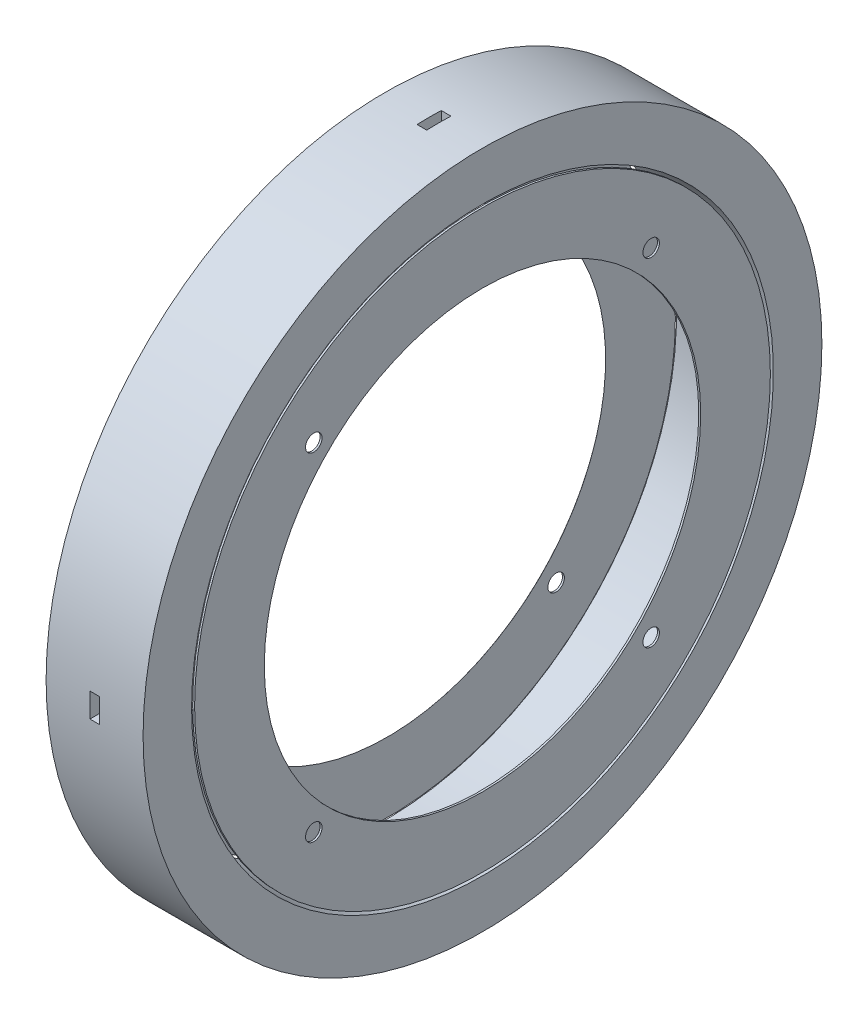
ISO-10303-21;
HEADER;
FILE_DESCRIPTION(('STEP AP214'),'2;1');
FILE_NAME('part.step','',(''),(''),'','','');
FILE_SCHEMA(('AUTOMOTIVE_DESIGN { 1 0 10303 214 1 1 1 1 }'));
ENDSEC;
DATA;
#1=APPLICATION_CONTEXT('core data for automotive mechanical design processes');
#2=APPLICATION_PROTOCOL_DEFINITION('international standard','automotive_design',2000,#1);
#3=PRODUCT_CONTEXT('',#1,'mechanical');
#4=PRODUCT('Part','Part','',(#3));
#5=PRODUCT_RELATED_PRODUCT_CATEGORY('part','',(#4));
#6=PRODUCT_DEFINITION_FORMATION('','',#4);
#7=PRODUCT_DEFINITION_CONTEXT('part definition',#1,'design');
#8=PRODUCT_DEFINITION('design','',#6,#7);
#9=PRODUCT_DEFINITION_SHAPE('','',#8);
#10=(LENGTH_UNIT() NAMED_UNIT(*) SI_UNIT(.MILLI.,.METRE.));
#11=(NAMED_UNIT(*) PLANE_ANGLE_UNIT() SI_UNIT($,.RADIAN.));
#12=(NAMED_UNIT(*) SI_UNIT($,.STERADIAN.) SOLID_ANGLE_UNIT());
#13=UNCERTAINTY_MEASURE_WITH_UNIT(LENGTH_MEASURE(1.E-05),#10,'distance_accuracy_value','');
#14=(GEOMETRIC_REPRESENTATION_CONTEXT(3) GLOBAL_UNCERTAINTY_ASSIGNED_CONTEXT((#13)) GLOBAL_UNIT_ASSIGNED_CONTEXT((#10,
#11,#12)) REPRESENTATION_CONTEXT('',''));
#15=CARTESIAN_POINT('',(0.,0.,0.));
#16=DIRECTION('',(0.,0.,1.));
#17=DIRECTION('',(1.,0.,0.));
#18=AXIS2_PLACEMENT_3D('',#15,#16,#17);
#19=CARTESIAN_POINT('',(10.,0.,0.));
#20=DIRECTION('',(-1.,0.,0.));
#21=DIRECTION('',(0.,0.,1.));
#22=AXIS2_PLACEMENT_3D('',#19,#20,#21);
#23=CYLINDRICAL_SURFACE('',#22,29.6875);
#24=CARTESIAN_POINT('',(10.,0.,0.));
#25=DIRECTION('',(-1.,0.,0.));
#26=DIRECTION('',(0.,0.,-1.));
#27=AXIS2_PLACEMENT_3D('',#24,#25,#26);
#28=CIRCLE('',#27,29.6875);
#29=CARTESIAN_POINT('',(10.,0.,-29.6875));
#30=VERTEX_POINT('',#29);
#31=EDGE_CURVE('E11',#30,#30,#28,.T.);
#32=ORIENTED_EDGE('',*,*,#31,.T.);
#33=EDGE_LOOP('',(#32));
#34=FACE_BOUND('',#33,.T.);
#35=CARTESIAN_POINT('',(9.8,0.,0.));
#36=DIRECTION('',(-1.,0.,0.));
#37=DIRECTION('',(0.,0.,-1.));
#38=AXIS2_PLACEMENT_3D('',#35,#36,#37);
#39=CIRCLE('',#38,29.6875);
#40=CARTESIAN_POINT('',(9.8,0.,-29.6875));
#41=VERTEX_POINT('',#40);
#42=EDGE_CURVE('E46',#41,#41,#39,.T.);
#43=ORIENTED_EDGE('',*,*,#42,.F.);
#44=EDGE_LOOP('',(#43));
#45=FACE_BOUND('',#44,.T.);
#46=ADVANCED_FACE('F39',(#34,#45),#23,.T.);
#47=CARTESIAN_POINT('',(10.,0.,0.));
#48=DIRECTION('',(1.,0.,0.));
#49=DIRECTION('',(0.,0.,-1.));
#50=AXIS2_PLACEMENT_3D('',#47,#48,#49);
#51=PLANE('',#50);
#52=CARTESIAN_POINT('',(10.,17.3948268171891,17.3948268171891));
#53=DIRECTION('',(1.,0.,0.));
#54=DIRECTION('',(0.,0.,-1.));
#55=AXIS2_PLACEMENT_3D('',#52,#53,#54);
#56=CIRCLE('',#55,0.849999999999993);
#57=CARTESIAN_POINT('',(10.,17.3948268171891,16.5448268171891));
#58=VERTEX_POINT('',#57);
#59=EDGE_CURVE('E82',#58,#58,#56,.T.);
#60=ORIENTED_EDGE('',*,*,#59,.F.);
#61=EDGE_LOOP('',(#60));
#62=FACE_BOUND('',#61,.T.);
#63=CARTESIAN_POINT('',(10.,-17.3948268171891,17.3948268171891));
#64=DIRECTION('',(1.,0.,0.));
#65=DIRECTION('',(0.,0.,-1.));
#66=AXIS2_PLACEMENT_3D('',#63,#64,#65);
#67=CIRCLE('',#66,0.849999999999993);
#68=CARTESIAN_POINT('',(10.,-17.3948268171891,16.5448268171891));
#69=VERTEX_POINT('',#68);
#70=EDGE_CURVE('E76',#69,#69,#67,.T.);
#71=ORIENTED_EDGE('',*,*,#70,.F.);
#72=EDGE_LOOP('',(#71));
#73=FACE_BOUND('',#72,.T.);
#74=CARTESIAN_POINT('',(10.,-17.3948268171891,-17.3948268171891));
#75=DIRECTION('',(1.,0.,0.));
#76=DIRECTION('',(0.,0.,-1.));
#77=AXIS2_PLACEMENT_3D('',#74,#75,#76);
#78=CIRCLE('',#77,0.849999999999993);
#79=CARTESIAN_POINT('',(10.,-17.3948268171891,-18.2448268171891));
#80=VERTEX_POINT('',#79);
#81=EDGE_CURVE('E73',#80,#80,#78,.T.);
#82=ORIENTED_EDGE('',*,*,#81,.F.);
#83=EDGE_LOOP('',(#82));
#84=FACE_BOUND('',#83,.T.);
#85=CARTESIAN_POINT('',(10.,17.3948268171891,-17.3948268171891));
#86=DIRECTION('',(1.,0.,0.));
#87=DIRECTION('',(0.,0.,-1.));
#88=AXIS2_PLACEMENT_3D('',#85,#86,#87);
#89=CIRCLE('',#88,0.849999999999993);
#90=CARTESIAN_POINT('',(10.,17.3948268171891,-18.2448268171891));
#91=VERTEX_POINT('',#90);
#92=EDGE_CURVE('E64',#91,#91,#89,.T.);
#93=ORIENTED_EDGE('',*,*,#92,.F.);
#94=EDGE_LOOP('',(#93));
#95=FACE_BOUND('',#94,.T.);
#96=CARTESIAN_POINT('',(10.,0.,0.));
#97=DIRECTION('',(1.,0.,0.));
#98=DIRECTION('',(0.,0.,1.));
#99=AXIS2_PLACEMENT_3D('',#96,#97,#98);
#100=CIRCLE('',#99,22.5);
#101=CARTESIAN_POINT('',(10.,0.,22.5));
#102=VERTEX_POINT('',#101);
#103=EDGE_CURVE('E54',#102,#102,#100,.T.);
#104=ORIENTED_EDGE('',*,*,#103,.F.);
#105=EDGE_LOOP('',(#104));
#106=FACE_BOUND('',#105,.T.);
#107=ORIENTED_EDGE('',*,*,#31,.F.);
#108=EDGE_LOOP('',(#107));
#109=FACE_BOUND('',#108,.T.);
#110=ADVANCED_FACE('F89',(#62,#73,#84,#95,#106,#109),#51,.T.);
#111=CARTESIAN_POINT('',(9.8,0.,0.));
#112=DIRECTION('',(1.,0.,0.));
#113=DIRECTION('',(0.,0.,-1.));
#114=AXIS2_PLACEMENT_3D('',#111,#112,#113);
#115=PLANE('',#114);
#116=CARTESIAN_POINT('',(9.8,17.3948268171891,17.3948268171891));
#117=DIRECTION('',(1.,0.,0.));
#118=DIRECTION('',(0.,0.,-1.));
#119=AXIS2_PLACEMENT_3D('',#116,#117,#118);
#120=CIRCLE('',#119,0.849999999999993);
#121=CARTESIAN_POINT('',(9.8,17.3948268171891,16.5448268171891));
#122=VERTEX_POINT('',#121);
#123=EDGE_CURVE('E79',#122,#122,#120,.T.);
#124=ORIENTED_EDGE('',*,*,#123,.T.);
#125=EDGE_LOOP('',(#124));
#126=FACE_BOUND('',#125,.T.);
#127=CARTESIAN_POINT('',(9.8,-17.3948268171891,17.3948268171891));
#128=DIRECTION('',(1.,0.,0.));
#129=DIRECTION('',(0.,0.,-1.));
#130=AXIS2_PLACEMENT_3D('',#127,#128,#129);
#131=CIRCLE('',#130,0.849999999999993);
#132=CARTESIAN_POINT('',(9.8,-17.3948268171891,16.5448268171891));
#133=VERTEX_POINT('',#132);
#134=EDGE_CURVE('E42',#133,#133,#131,.T.);
#135=ORIENTED_EDGE('',*,*,#134,.T.);
#136=EDGE_LOOP('',(#135));
#137=FACE_BOUND('',#136,.T.);
#138=CARTESIAN_POINT('',(9.8,-17.3948268171891,-17.3948268171891));
#139=DIRECTION('',(1.,0.,0.));
#140=DIRECTION('',(0.,0.,-1.));
#141=AXIS2_PLACEMENT_3D('',#138,#139,#140);
#142=CIRCLE('',#141,0.849999999999993);
#143=CARTESIAN_POINT('',(9.8,-17.3948268171891,-18.2448268171891));
#144=VERTEX_POINT('',#143);
#145=EDGE_CURVE('E68',#144,#144,#142,.T.);
#146=ORIENTED_EDGE('',*,*,#145,.T.);
#147=EDGE_LOOP('',(#146));
#148=FACE_BOUND('',#147,.T.);
#149=CARTESIAN_POINT('',(9.8,17.3948268171891,-17.3948268171891));
#150=DIRECTION('',(1.,0.,0.));
#151=DIRECTION('',(0.,0.,-1.));
#152=AXIS2_PLACEMENT_3D('',#149,#150,#151);
#153=CIRCLE('',#152,0.849999999999993);
#154=CARTESIAN_POINT('',(9.8,17.3948268171891,-18.2448268171891));
#155=VERTEX_POINT('',#154);
#156=EDGE_CURVE('E60',#155,#155,#153,.T.);
#157=ORIENTED_EDGE('',*,*,#156,.T.);
#158=EDGE_LOOP('',(#157));
#159=FACE_BOUND('',#158,.T.);
#160=CARTESIAN_POINT('',(9.8,0.,0.));
#161=DIRECTION('',(1.,0.,0.));
#162=DIRECTION('',(0.,0.,-1.));
#163=AXIS2_PLACEMENT_3D('',#160,#161,#162);
#164=CIRCLE('',#163,22.5);
#165=CARTESIAN_POINT('',(9.8,0.,-22.5));
#166=VERTEX_POINT('',#165);
#167=EDGE_CURVE('E51',#166,#166,#164,.T.);
#168=ORIENTED_EDGE('',*,*,#167,.T.);
#169=EDGE_LOOP('',(#168));
#170=FACE_BOUND('',#169,.T.);
#171=ORIENTED_EDGE('',*,*,#42,.T.);
#172=EDGE_LOOP('',(#171));
#173=FACE_BOUND('',#172,.T.);
#174=ADVANCED_FACE('F92',(#126,#137,#148,#159,#170,#173),#115,.F.);
#175=CARTESIAN_POINT('',(6.66666666666667,0.,0.));
#176=DIRECTION('',(1.,0.,0.));
#177=DIRECTION('',(0.,0.,-1.));
#178=AXIS2_PLACEMENT_3D('',#175,#176,#177);
#179=CYLINDRICAL_SURFACE('',#178,22.5);
#180=ORIENTED_EDGE('',*,*,#103,.T.);
#181=EDGE_LOOP('',(#180));
#182=FACE_BOUND('',#181,.T.);
#183=ORIENTED_EDGE('',*,*,#167,.F.);
#184=EDGE_LOOP('',(#183));
#185=FACE_BOUND('',#184,.T.);
#186=ADVANCED_FACE('F106',(#182,#185),#179,.F.);
#187=CARTESIAN_POINT('',(10.,17.3948268171891,-17.3948268171891));
#188=DIRECTION('',(1.,0.,0.));
#189=DIRECTION('',(0.,0.,-1.));
#190=AXIS2_PLACEMENT_3D('',#187,#188,#189);
#191=CYLINDRICAL_SURFACE('',#190,0.849999999999993);
#192=ORIENTED_EDGE('',*,*,#92,.T.);
#193=EDGE_LOOP('',(#192));
#194=FACE_BOUND('',#193,.T.);
#195=ORIENTED_EDGE('',*,*,#156,.F.);
#196=EDGE_LOOP('',(#195));
#197=FACE_BOUND('',#196,.T.);
#198=ADVANCED_FACE('F102',(#194,#197),#191,.F.);
#199=CARTESIAN_POINT('',(10.,-17.3948268171891,-17.3948268171891));
#200=DIRECTION('',(1.,0.,0.));
#201=DIRECTION('',(0.,0.,-1.));
#202=AXIS2_PLACEMENT_3D('',#199,#200,#201);
#203=CYLINDRICAL_SURFACE('',#202,0.849999999999993);
#204=ORIENTED_EDGE('',*,*,#81,.T.);
#205=EDGE_LOOP('',(#204));
#206=FACE_BOUND('',#205,.T.);
#207=ORIENTED_EDGE('',*,*,#145,.F.);
#208=EDGE_LOOP('',(#207));
#209=FACE_BOUND('',#208,.T.);
#210=ADVANCED_FACE('F105',(#206,#209),#203,.F.);
#211=CARTESIAN_POINT('',(10.,-17.3948268171891,17.3948268171891));
#212=DIRECTION('',(1.,0.,0.));
#213=DIRECTION('',(0.,0.,-1.));
#214=AXIS2_PLACEMENT_3D('',#211,#212,#213);
#215=CYLINDRICAL_SURFACE('',#214,0.849999999999993);
#216=ORIENTED_EDGE('',*,*,#70,.T.);
#217=EDGE_LOOP('',(#216));
#218=FACE_BOUND('',#217,.T.);
#219=ORIENTED_EDGE('',*,*,#134,.F.);
#220=EDGE_LOOP('',(#219));
#221=FACE_BOUND('',#220,.T.);
#222=ADVANCED_FACE('F112',(#218,#221),#215,.F.);
#223=CARTESIAN_POINT('',(10.,17.3948268171891,17.3948268171891));
#224=DIRECTION('',(1.,0.,0.));
#225=DIRECTION('',(0.,0.,-1.));
#226=AXIS2_PLACEMENT_3D('',#223,#224,#225);
#227=CYLINDRICAL_SURFACE('',#226,0.849999999999993);
#228=ORIENTED_EDGE('',*,*,#59,.T.);
#229=EDGE_LOOP('',(#228));
#230=FACE_BOUND('',#229,.T.);
#231=ORIENTED_EDGE('',*,*,#123,.F.);
#232=EDGE_LOOP('',(#231));
#233=FACE_BOUND('',#232,.T.);
#234=ADVANCED_FACE('F86',(#230,#233),#227,.F.);
#235=CLOSED_SHELL('',(#46,#110,#174,#186,#198,#210,#222,#234));
#236=MANIFOLD_SOLID_BREP('B2',#235);
#237=CARTESIAN_POINT('',(0.,0.,0.));
#238=DIRECTION('',(1.,0.,0.));
#239=DIRECTION('',(0.,0.,-1.));
#240=AXIS2_PLACEMENT_3D('',#237,#238,#239);
#241=CYLINDRICAL_SURFACE('',#240,29.6875);
#242=CARTESIAN_POINT('',(0.,0.,0.));
#243=DIRECTION('',(1.,0.,0.));
#244=DIRECTION('',(0.,0.,1.));
#245=AXIS2_PLACEMENT_3D('',#242,#243,#244);
#246=CIRCLE('',#245,29.6875);
#247=CARTESIAN_POINT('',(0.,0.,29.6875));
#248=VERTEX_POINT('',#247);
#249=EDGE_CURVE('E200',#248,#248,#246,.T.);
#250=ORIENTED_EDGE('',*,*,#249,.T.);
#251=EDGE_LOOP('',(#250));
#252=FACE_BOUND('',#251,.T.);
#253=CARTESIAN_POINT('',(0.2,0.,0.));
#254=DIRECTION('',(1.,0.,0.));
#255=DIRECTION('',(0.,0.,1.));
#256=AXIS2_PLACEMENT_3D('',#253,#254,#255);
#257=CIRCLE('',#256,29.6875);
#258=CARTESIAN_POINT('',(0.2,0.,29.6875));
#259=VERTEX_POINT('',#258);
#260=EDGE_CURVE('E204',#259,#259,#257,.T.);
#261=ORIENTED_EDGE('',*,*,#260,.F.);
#262=EDGE_LOOP('',(#261));
#263=FACE_BOUND('',#262,.T.);
#264=ADVANCED_FACE('F193',(#252,#263),#241,.T.);
#265=CARTESIAN_POINT('',(0.,0.,0.));
#266=DIRECTION('',(-1.,0.,0.));
#267=DIRECTION('',(0.,0.,1.));
#268=AXIS2_PLACEMENT_3D('',#265,#266,#267);
#269=PLANE('',#268);
#270=CARTESIAN_POINT('',(0.,0.,0.));
#271=DIRECTION('',(-1.,0.,0.));
#272=DIRECTION('',(0.,0.,1.));
#273=AXIS2_PLACEMENT_3D('',#270,#271,#272);
#274=CIRCLE('',#273,22.9472135955);
#275=CARTESIAN_POINT('',(0.,0.,22.9472135955));
#276=VERTEX_POINT('',#275);
#277=EDGE_CURVE('E38',#276,#276,#274,.F.);
#278=ORIENTED_EDGE('',*,*,#277,.T.);
#279=EDGE_LOOP('',(#278));
#280=FACE_BOUND('',#279,.T.);
#281=CARTESIAN_POINT('',(0.,17.3948268171891,17.3948268171891));
#282=DIRECTION('',(-1.,0.,0.));
#283=DIRECTION('',(0.,0.,1.));
#284=AXIS2_PLACEMENT_3D('',#281,#282,#283);
#285=CIRCLE('',#284,0.849999999999993);
#286=CARTESIAN_POINT('',(0.,17.3948268171891,18.2448268171891));
#287=VERTEX_POINT('',#286);
#288=EDGE_CURVE('E223',#287,#287,#285,.T.);
#289=ORIENTED_EDGE('',*,*,#288,.F.);
#290=EDGE_LOOP('',(#289));
#291=FACE_BOUND('',#290,.T.);
#292=CARTESIAN_POINT('',(0.,-17.3948268171891,17.3948268171891));
#293=DIRECTION('',(-1.,0.,0.));
#294=DIRECTION('',(0.,0.,1.));
#295=AXIS2_PLACEMENT_3D('',#292,#293,#294);
#296=CIRCLE('',#295,0.849999999999993);
#297=CARTESIAN_POINT('',(0.,-17.3948268171891,18.2448268171891));
#298=VERTEX_POINT('',#297);
#299=EDGE_CURVE('E220',#298,#298,#296,.T.);
#300=ORIENTED_EDGE('',*,*,#299,.F.);
#301=EDGE_LOOP('',(#300));
#302=FACE_BOUND('',#301,.T.);
#303=CARTESIAN_POINT('',(0.,-17.3948268171891,-17.3948268171891));
#304=DIRECTION('',(-1.,0.,0.));
#305=DIRECTION('',(0.,0.,1.));
#306=AXIS2_PLACEMENT_3D('',#303,#304,#305);
#307=CIRCLE('',#306,0.849999999999993);
#308=CARTESIAN_POINT('',(0.,-17.3948268171891,-16.5448268171891));
#309=VERTEX_POINT('',#308);
#310=EDGE_CURVE('E219',#309,#309,#307,.T.);
#311=ORIENTED_EDGE('',*,*,#310,.F.);
#312=EDGE_LOOP('',(#311));
#313=FACE_BOUND('',#312,.T.);
#314=CARTESIAN_POINT('',(0.,17.3948268171891,-17.3948268171891));
#315=DIRECTION('',(-1.,0.,0.));
#316=DIRECTION('',(0.,0.,1.));
#317=AXIS2_PLACEMENT_3D('',#314,#315,#316);
#318=CIRCLE('',#317,0.849999999999993);
#319=CARTESIAN_POINT('',(0.,17.3948268171891,-16.5448268171891));
#320=VERTEX_POINT('',#319);
#321=EDGE_CURVE('E237',#320,#320,#318,.T.);
#322=ORIENTED_EDGE('',*,*,#321,.F.);
#323=EDGE_LOOP('',(#322));
#324=FACE_BOUND('',#323,.T.);
#325=ORIENTED_EDGE('',*,*,#249,.F.);
#326=EDGE_LOOP('',(#325));
#327=FACE_BOUND('',#326,.T.);
#328=ADVANCED_FACE('F258',(#280,#291,#302,#313,#324,#327),#269,.T.);
#329=CARTESIAN_POINT('',(0.2,0.,0.));
#330=DIRECTION('',(-1.,0.,0.));
#331=DIRECTION('',(0.,0.,1.));
#332=AXIS2_PLACEMENT_3D('',#329,#330,#331);
#333=PLANE('',#332);
#334=CARTESIAN_POINT('',(0.2,17.3948268171891,17.3948268171891));
#335=DIRECTION('',(-1.,0.,0.));
#336=DIRECTION('',(0.,0.,1.));
#337=AXIS2_PLACEMENT_3D('',#334,#335,#336);
#338=CIRCLE('',#337,0.849999999999993);
#339=CARTESIAN_POINT('',(0.2,17.3948268171891,18.2448268171891));
#340=VERTEX_POINT('',#339);
#341=EDGE_CURVE('E221',#340,#340,#338,.T.);
#342=ORIENTED_EDGE('',*,*,#341,.T.);
#343=EDGE_LOOP('',(#342));
#344=FACE_BOUND('',#343,.T.);
#345=CARTESIAN_POINT('',(0.2,-17.3948268171891,17.3948268171891));
#346=DIRECTION('',(-1.,0.,0.));
#347=DIRECTION('',(0.,0.,1.));
#348=AXIS2_PLACEMENT_3D('',#345,#346,#347);
#349=CIRCLE('',#348,0.849999999999993);
#350=CARTESIAN_POINT('',(0.2,-17.3948268171891,18.2448268171891));
#351=VERTEX_POINT('',#350);
#352=EDGE_CURVE('E217',#351,#351,#349,.T.);
#353=ORIENTED_EDGE('',*,*,#352,.T.);
#354=EDGE_LOOP('',(#353));
#355=FACE_BOUND('',#354,.T.);
#356=CARTESIAN_POINT('',(0.2,-17.3948268171891,-17.3948268171891));
#357=DIRECTION('',(-1.,0.,0.));
#358=DIRECTION('',(0.,0.,1.));
#359=AXIS2_PLACEMENT_3D('',#356,#357,#358);
#360=CIRCLE('',#359,0.849999999999993);
#361=CARTESIAN_POINT('',(0.2,-17.3948268171891,-16.5448268171891));
#362=VERTEX_POINT('',#361);
#363=EDGE_CURVE('E235',#362,#362,#360,.T.);
#364=ORIENTED_EDGE('',*,*,#363,.T.);
#365=EDGE_LOOP('',(#364));
#366=FACE_BOUND('',#365,.T.);
#367=CARTESIAN_POINT('',(0.2,17.3948268171891,-17.3948268171891));
#368=DIRECTION('',(-1.,0.,0.));
#369=DIRECTION('',(0.,0.,1.));
#370=AXIS2_PLACEMENT_3D('',#367,#368,#369);
#371=CIRCLE('',#370,0.849999999999993);
#372=CARTESIAN_POINT('',(0.2,17.3948268171891,-16.5448268171891));
#373=VERTEX_POINT('',#372);
#374=EDGE_CURVE('E212',#373,#373,#371,.T.);
#375=ORIENTED_EDGE('',*,*,#374,.T.);
#376=EDGE_LOOP('',(#375));
#377=FACE_BOUND('',#376,.T.);
#378=CARTESIAN_POINT('',(0.2,0.,0.));
#379=DIRECTION('',(-1.,0.,0.));
#380=DIRECTION('',(0.,0.,1.));
#381=AXIS2_PLACEMENT_3D('',#378,#379,#380);
#382=CIRCLE('',#381,22.5);
#383=CARTESIAN_POINT('',(0.2,0.,22.5));
#384=VERTEX_POINT('',#383);
#385=EDGE_CURVE('E209',#384,#384,#382,.T.);
#386=ORIENTED_EDGE('',*,*,#385,.T.);
#387=EDGE_LOOP('',(#386));
#388=FACE_BOUND('',#387,.T.);
#389=ORIENTED_EDGE('',*,*,#260,.T.);
#390=EDGE_LOOP('',(#389));
#391=FACE_BOUND('',#390,.T.);
#392=ADVANCED_FACE('F244',(#344,#355,#366,#377,#388,#391),#333,.F.);
#393=CARTESIAN_POINT('',(0.,17.3948268171891,-17.3948268171891));
#394=DIRECTION('',(-1.,0.,0.));
#395=DIRECTION('',(0.,0.,1.));
#396=AXIS2_PLACEMENT_3D('',#393,#394,#395);
#397=CYLINDRICAL_SURFACE('',#396,0.849999999999993);
#398=ORIENTED_EDGE('',*,*,#321,.T.);
#399=EDGE_LOOP('',(#398));
#400=FACE_BOUND('',#399,.T.);
#401=ORIENTED_EDGE('',*,*,#374,.F.);
#402=EDGE_LOOP('',(#401));
#403=FACE_BOUND('',#402,.T.);
#404=ADVANCED_FACE('F247',(#400,#403),#397,.F.);
#405=CARTESIAN_POINT('',(0.,-17.3948268171891,-17.3948268171891));
#406=DIRECTION('',(-1.,0.,0.));
#407=DIRECTION('',(0.,0.,1.));
#408=AXIS2_PLACEMENT_3D('',#405,#406,#407);
#409=CYLINDRICAL_SURFACE('',#408,0.849999999999993);
#410=ORIENTED_EDGE('',*,*,#310,.T.);
#411=EDGE_LOOP('',(#410));
#412=FACE_BOUND('',#411,.T.);
#413=ORIENTED_EDGE('',*,*,#363,.F.);
#414=EDGE_LOOP('',(#413));
#415=FACE_BOUND('',#414,.T.);
#416=ADVANCED_FACE('F249',(#412,#415),#409,.F.);
#417=CARTESIAN_POINT('',(0.,-17.3948268171891,17.3948268171891));
#418=DIRECTION('',(-1.,0.,0.));
#419=DIRECTION('',(0.,0.,1.));
#420=AXIS2_PLACEMENT_3D('',#417,#418,#419);
#421=CYLINDRICAL_SURFACE('',#420,0.849999999999993);
#422=ORIENTED_EDGE('',*,*,#299,.T.);
#423=EDGE_LOOP('',(#422));
#424=FACE_BOUND('',#423,.T.);
#425=ORIENTED_EDGE('',*,*,#352,.F.);
#426=EDGE_LOOP('',(#425));
#427=FACE_BOUND('',#426,.T.);
#428=ADVANCED_FACE('F255',(#424,#427),#421,.F.);
#429=CARTESIAN_POINT('',(0.,17.3948268171891,17.3948268171891));
#430=DIRECTION('',(-1.,0.,0.));
#431=DIRECTION('',(0.,0.,1.));
#432=AXIS2_PLACEMENT_3D('',#429,#430,#431);
#433=CYLINDRICAL_SURFACE('',#432,0.849999999999993);
#434=ORIENTED_EDGE('',*,*,#288,.T.);
#435=EDGE_LOOP('',(#434));
#436=FACE_BOUND('',#435,.T.);
#437=ORIENTED_EDGE('',*,*,#341,.F.);
#438=EDGE_LOOP('',(#437));
#439=FACE_BOUND('',#438,.T.);
#440=ADVANCED_FACE('F283',(#436,#439),#433,.F.);
#441=CARTESIAN_POINT('',(0.600000000000004,0.,0.));
#442=DIRECTION('',(-1.,0.,0.));
#443=DIRECTION('',(0.,0.,1.));
#444=AXIS2_PLACEMENT_3D('',#441,#442,#443);
#445=TOROIDAL_SURFACE('',#444,22.9472135955,0.600000000000004);
#446=ORIENTED_EDGE('',*,*,#277,.F.);
#447=EDGE_LOOP('',(#446));
#448=FACE_BOUND('',#447,.T.);
#449=ORIENTED_EDGE('',*,*,#385,.F.);
#450=EDGE_LOOP('',(#449));
#451=FACE_BOUND('',#450,.T.);
#452=ADVANCED_FACE('F195',(#448,#451),#445,.T.);
#453=CLOSED_SHELL('',(#264,#328,#392,#404,#416,#428,#440,#452));
#454=MANIFOLD_SOLID_BREP('B6',#453);
#455=CARTESIAN_POINT('',(0.,0.,0.));
#456=DIRECTION('',(1.,0.,0.));
#457=DIRECTION('',(0.,0.,-1.));
#458=AXIS2_PLACEMENT_3D('',#455,#456,#457);
#459=CYLINDRICAL_SURFACE('',#458,35.);
#460=CARTESIAN_POINT('',(5.5,0.,0.));
#461=DIRECTION('',(1.,0.,0.));
#462=DIRECTION('',(0.,0.,-1.));
#463=AXIS2_PLACEMENT_3D('',#460,#461,#462);
#464=CIRCLE('',#463,35.);
#465=CARTESIAN_POINT('',(5.5,-34.9776714490831,1.25));
#466=VERTEX_POINT('',#465);
#467=CARTESIAN_POINT('',(5.5,-34.9776714490831,-1.25));
#468=VERTEX_POINT('',#467);
#469=EDGE_CURVE('E480',#466,#468,#464,.T.);
#470=ORIENTED_EDGE('',*,*,#469,.T.);
#471=DIRECTION('',(1.,0.,0.));
#472=VECTOR('',#471,1.);
#473=CARTESIAN_POINT('',(0.,-34.9776714490831,-1.25));
#474=LINE('',#473,#472);
#475=CARTESIAN_POINT('',(4.5,-34.9776714490831,-1.25));
#476=VERTEX_POINT('',#475);
#477=EDGE_CURVE('E465',#468,#476,#474,.F.);
#478=ORIENTED_EDGE('',*,*,#477,.T.);
#479=CARTESIAN_POINT('',(4.5,0.,0.));
#480=DIRECTION('',(-1.,0.,0.));
#481=DIRECTION('',(0.,0.,1.));
#482=AXIS2_PLACEMENT_3D('',#479,#480,#481);
#483=CIRCLE('',#482,35.);
#484=CARTESIAN_POINT('',(4.5,-34.9776714490831,1.25));
#485=VERTEX_POINT('',#484);
#486=EDGE_CURVE('E456',#476,#485,#483,.T.);
#487=ORIENTED_EDGE('',*,*,#486,.T.);
#488=DIRECTION('',(1.,0.,0.));
#489=VECTOR('',#488,1.);
#490=CARTESIAN_POINT('',(0.,-34.9776714490831,1.25));
#491=LINE('',#490,#489);
#492=EDGE_CURVE('E477',#485,#466,#491,.T.);
#493=ORIENTED_EDGE('',*,*,#492,.T.);
#494=EDGE_LOOP('',(#470,#478,#487,#493));
#495=FACE_BOUND('',#494,.T.);
#496=CARTESIAN_POINT('',(4.5,0.,0.));
#497=DIRECTION('',(-1.,0.,0.));
#498=DIRECTION('',(0.,0.,1.));
#499=AXIS2_PLACEMENT_3D('',#496,#497,#498);
#500=CIRCLE('',#499,35.);
#501=CARTESIAN_POINT('',(4.5,34.9776714490831,1.25));
#502=VERTEX_POINT('',#501);
#503=CARTESIAN_POINT('',(4.5,34.9776714490831,-1.25));
#504=VERTEX_POINT('',#503);
#505=EDGE_CURVE('E501',#502,#504,#500,.T.);
#506=ORIENTED_EDGE('',*,*,#505,.T.);
#507=DIRECTION('',(1.,0.,0.));
#508=VECTOR('',#507,1.);
#509=CARTESIAN_POINT('',(0.,34.9776714490831,-1.25));
#510=LINE('',#509,#508);
#511=CARTESIAN_POINT('',(5.5,34.9776714490831,-1.25));
#512=VERTEX_POINT('',#511);
#513=EDGE_CURVE('E516',#504,#512,#510,.T.);
#514=ORIENTED_EDGE('',*,*,#513,.T.);
#515=CARTESIAN_POINT('',(5.5,0.,0.));
#516=DIRECTION('',(1.,0.,0.));
#517=DIRECTION('',(0.,0.,-1.));
#518=AXIS2_PLACEMENT_3D('',#515,#516,#517);
#519=CIRCLE('',#518,35.);
#520=CARTESIAN_POINT('',(5.5,34.9776714490831,1.25));
#521=VERTEX_POINT('',#520);
#522=EDGE_CURVE('E495',#512,#521,#519,.T.);
#523=ORIENTED_EDGE('',*,*,#522,.T.);
#524=DIRECTION('',(1.,0.,0.));
#525=VECTOR('',#524,1.);
#526=CARTESIAN_POINT('',(0.,34.9776714490831,1.25));
#527=LINE('',#526,#525);
#528=EDGE_CURVE('E498',#521,#502,#527,.F.);
#529=ORIENTED_EDGE('',*,*,#528,.T.);
#530=EDGE_LOOP('',(#506,#514,#523,#529));
#531=FACE_BOUND('',#530,.T.);
#532=CARTESIAN_POINT('',(4.5,0.,0.));
#533=DIRECTION('',(-1.,0.,0.));
#534=DIRECTION('',(0.,0.,1.));
#535=AXIS2_PLACEMENT_3D('',#532,#533,#534);
#536=CIRCLE('',#535,35.);
#537=CARTESIAN_POINT('',(4.5,-1.25,34.9776714490831));
#538=VERTEX_POINT('',#537);
#539=CARTESIAN_POINT('',(4.5,1.25,34.9776714490831));
#540=VERTEX_POINT('',#539);
#541=EDGE_CURVE('E533',#538,#540,#536,.T.);
#542=ORIENTED_EDGE('',*,*,#541,.T.);
#543=DIRECTION('',(1.,0.,0.));
#544=VECTOR('',#543,1.);
#545=CARTESIAN_POINT('',(0.,1.25,34.9776714490831));
#546=LINE('',#545,#544);
#547=CARTESIAN_POINT('',(5.5,1.25,34.9776714490831));
#548=VERTEX_POINT('',#547);
#549=EDGE_CURVE('E548',#540,#548,#546,.T.);
#550=ORIENTED_EDGE('',*,*,#549,.T.);
#551=CARTESIAN_POINT('',(5.5,0.,0.));
#552=DIRECTION('',(1.,0.,0.));
#553=DIRECTION('',(0.,0.,-1.));
#554=AXIS2_PLACEMENT_3D('',#551,#552,#553);
#555=CIRCLE('',#554,35.);
#556=CARTESIAN_POINT('',(5.5,-1.25,34.9776714490831));
#557=VERTEX_POINT('',#556);
#558=EDGE_CURVE('E527',#548,#557,#555,.T.);
#559=ORIENTED_EDGE('',*,*,#558,.T.);
#560=DIRECTION('',(1.,0.,0.));
#561=VECTOR('',#560,1.);
#562=CARTESIAN_POINT('',(0.,-1.25,34.9776714490831));
#563=LINE('',#562,#561);
#564=EDGE_CURVE('E530',#557,#538,#563,.F.);
#565=ORIENTED_EDGE('',*,*,#564,.T.);
#566=EDGE_LOOP('',(#542,#550,#559,#565));
#567=FACE_BOUND('',#566,.T.);
#568=CARTESIAN_POINT('',(5.5,0.,0.));
#569=DIRECTION('',(1.,0.,0.));
#570=DIRECTION('',(0.,0.,-1.));
#571=AXIS2_PLACEMENT_3D('',#568,#569,#570);
#572=CIRCLE('',#571,35.);
#573=CARTESIAN_POINT('',(5.5,-1.25,-34.9776714490831));
#574=VERTEX_POINT('',#573);
#575=CARTESIAN_POINT('',(5.5,1.25,-34.9776714490831));
#576=VERTEX_POINT('',#575);
#577=EDGE_CURVE('E565',#574,#576,#572,.T.);
#578=ORIENTED_EDGE('',*,*,#577,.T.);
#579=DIRECTION('',(1.,0.,0.));
#580=VECTOR('',#579,1.);
#581=CARTESIAN_POINT('',(0.,1.25,-34.9776714490831));
#582=LINE('',#581,#580);
#583=CARTESIAN_POINT('',(4.5,1.25,-34.9776714490831));
#584=VERTEX_POINT('',#583);
#585=EDGE_CURVE('E580',#576,#584,#582,.F.);
#586=ORIENTED_EDGE('',*,*,#585,.T.);
#587=CARTESIAN_POINT('',(4.5,0.,0.));
#588=DIRECTION('',(-1.,0.,0.));
#589=DIRECTION('',(0.,0.,1.));
#590=AXIS2_PLACEMENT_3D('',#587,#588,#589);
#591=CIRCLE('',#590,35.);
#592=CARTESIAN_POINT('',(4.5,-1.25,-34.9776714490831));
#593=VERTEX_POINT('',#592);
#594=EDGE_CURVE('E559',#584,#593,#591,.T.);
#595=ORIENTED_EDGE('',*,*,#594,.T.);
#596=DIRECTION('',(1.,0.,0.));
#597=VECTOR('',#596,1.);
#598=CARTESIAN_POINT('',(0.,-1.25,-34.9776714490831));
#599=LINE('',#598,#597);
#600=EDGE_CURVE('E562',#593,#574,#599,.T.);
#601=ORIENTED_EDGE('',*,*,#600,.T.);
#602=EDGE_LOOP('',(#578,#586,#595,#601));
#603=FACE_BOUND('',#602,.T.);
#604=CARTESIAN_POINT('',(0.,0.,0.));
#605=DIRECTION('',(1.,0.,0.));
#606=DIRECTION('',(0.,0.,-1.));
#607=AXIS2_PLACEMENT_3D('',#604,#605,#606);
#608=CIRCLE('',#607,35.);
#609=CARTESIAN_POINT('',(0.,0.,-35.));
#610=VERTEX_POINT('',#609);
#611=EDGE_CURVE('E191',#610,#610,#608,.T.);
#612=ORIENTED_EDGE('',*,*,#611,.T.);
#613=EDGE_LOOP('',(#612));
#614=FACE_BOUND('',#613,.T.);
#615=CARTESIAN_POINT('',(10.,0.,0.));
#616=DIRECTION('',(1.,0.,0.));
#617=DIRECTION('',(0.,0.,-1.));
#618=AXIS2_PLACEMENT_3D('',#615,#616,#617);
#619=CIRCLE('',#618,35.);
#620=CARTESIAN_POINT('',(10.,0.,-35.));
#621=VERTEX_POINT('',#620);
#622=EDGE_CURVE('E345',#621,#621,#619,.T.);
#623=ORIENTED_EDGE('',*,*,#622,.F.);
#624=EDGE_LOOP('',(#623));
#625=FACE_BOUND('',#624,.T.);
#626=ADVANCED_FACE('F338',(#495,#531,#567,#603,#614,#625),#459,.T.);
#627=CARTESIAN_POINT('',(0.,35.,0.));
#628=DIRECTION('',(-1.,0.,0.));
#629=DIRECTION('',(0.,0.,1.));
#630=AXIS2_PLACEMENT_3D('',#627,#628,#629);
#631=PLANE('',#630);
#632=CARTESIAN_POINT('',(0.,0.,0.));
#633=DIRECTION('',(-1.,0.,0.));
#634=DIRECTION('',(0.,0.,1.));
#635=AXIS2_PLACEMENT_3D('',#632,#633,#634);
#636=CIRCLE('',#635,30.);
#637=CARTESIAN_POINT('',(0.,0.,30.));
#638=VERTEX_POINT('',#637);
#639=EDGE_CURVE('E583',#638,#638,#636,.T.);
#640=ORIENTED_EDGE('',*,*,#639,.F.);
#641=EDGE_LOOP('',(#640));
#642=FACE_BOUND('',#641,.T.);
#643=ORIENTED_EDGE('',*,*,#611,.F.);
#644=EDGE_LOOP('',(#643));
#645=FACE_BOUND('',#644,.T.);
#646=ADVANCED_FACE('F594',(#642,#645),#631,.T.);
#647=CARTESIAN_POINT('',(10.,0.,0.));
#648=DIRECTION('',(1.,0.,0.));
#649=DIRECTION('',(0.,0.,-1.));
#650=AXIS2_PLACEMENT_3D('',#647,#648,#649);
#651=PLANE('',#650);
#652=CARTESIAN_POINT('',(9.99999999999999,0.,0.));
#653=DIRECTION('',(-1.,0.,0.));
#654=DIRECTION('',(0.,0.,1.));
#655=AXIS2_PLACEMENT_3D('',#652,#653,#654);
#656=CIRCLE('',#655,30.);
#657=CARTESIAN_POINT('',(9.99999999999999,0.,30.));
#658=VERTEX_POINT('',#657);
#659=EDGE_CURVE('E586',#658,#658,#656,.T.);
#660=ORIENTED_EDGE('',*,*,#659,.T.);
#661=EDGE_LOOP('',(#660));
#662=FACE_BOUND('',#661,.T.);
#663=ORIENTED_EDGE('',*,*,#622,.T.);
#664=EDGE_LOOP('',(#663));
#665=FACE_BOUND('',#664,.T.);
#666=ADVANCED_FACE('F591',(#662,#665),#651,.T.);
#667=CARTESIAN_POINT('',(0.,0.,0.));
#668=DIRECTION('',(-1.,0.,0.));
#669=DIRECTION('',(0.,0.,1.));
#670=AXIS2_PLACEMENT_3D('',#667,#668,#669);
#671=CYLINDRICAL_SURFACE('',#670,30.);
#672=DIRECTION('',(-1.,0.,0.));
#673=VECTOR('',#672,1.);
#674=CARTESIAN_POINT('',(0.,-29.9739470207045,-1.25));
#675=LINE('',#674,#673);
#676=CARTESIAN_POINT('',(5.5,-29.9739470207045,-1.25));
#677=VERTEX_POINT('',#676);
#678=CARTESIAN_POINT('',(4.5,-29.9739470207045,-1.25));
#679=VERTEX_POINT('',#678);
#680=EDGE_CURVE('E462',#677,#679,#675,.T.);
#681=ORIENTED_EDGE('',*,*,#680,.F.);
#682=CARTESIAN_POINT('',(5.5,0.,0.));
#683=DIRECTION('',(1.,0.,0.));
#684=DIRECTION('',(0.,0.,-1.));
#685=AXIS2_PLACEMENT_3D('',#682,#683,#684);
#686=CIRCLE('',#685,30.);
#687=CARTESIAN_POINT('',(5.5,-29.9739470207045,1.25));
#688=VERTEX_POINT('',#687);
#689=EDGE_CURVE('E360',#688,#677,#686,.T.);
#690=ORIENTED_EDGE('',*,*,#689,.F.);
#691=DIRECTION('',(-1.,0.,0.));
#692=VECTOR('',#691,1.);
#693=CARTESIAN_POINT('',(0.,-29.9739470207045,1.25));
#694=LINE('',#693,#692);
#695=CARTESIAN_POINT('',(4.5,-29.9739470207045,1.25));
#696=VERTEX_POINT('',#695);
#697=EDGE_CURVE('E471',#696,#688,#694,.F.);
#698=ORIENTED_EDGE('',*,*,#697,.F.);
#699=CARTESIAN_POINT('',(4.5,0.,0.));
#700=DIRECTION('',(-1.,0.,0.));
#701=DIRECTION('',(0.,0.,1.));
#702=AXIS2_PLACEMENT_3D('',#699,#700,#701);
#703=CIRCLE('',#702,30.);
#704=EDGE_CURVE('E453',#679,#696,#703,.T.);
#705=ORIENTED_EDGE('',*,*,#704,.F.);
#706=EDGE_LOOP('',(#681,#690,#698,#705));
#707=FACE_BOUND('',#706,.T.);
#708=DIRECTION('',(-1.,0.,0.));
#709=VECTOR('',#708,1.);
#710=CARTESIAN_POINT('',(0.,29.9739470207045,-1.25));
#711=LINE('',#710,#709);
#712=CARTESIAN_POINT('',(4.5,29.9739470207045,-1.25));
#713=VERTEX_POINT('',#712);
#714=CARTESIAN_POINT('',(5.5,29.9739470207045,-1.25));
#715=VERTEX_POINT('',#714);
#716=EDGE_CURVE('E507',#713,#715,#711,.F.);
#717=ORIENTED_EDGE('',*,*,#716,.F.);
#718=CARTESIAN_POINT('',(4.5,0.,0.));
#719=DIRECTION('',(-1.,0.,0.));
#720=DIRECTION('',(0.,0.,1.));
#721=AXIS2_PLACEMENT_3D('',#718,#719,#720);
#722=CIRCLE('',#721,30.);
#723=CARTESIAN_POINT('',(4.5,29.9739470207045,1.25));
#724=VERTEX_POINT('',#723);
#725=EDGE_CURVE('E493',#724,#713,#722,.T.);
#726=ORIENTED_EDGE('',*,*,#725,.F.);
#727=DIRECTION('',(-1.,0.,0.));
#728=VECTOR('',#727,1.);
#729=CARTESIAN_POINT('',(0.,29.9739470207045,1.25));
#730=LINE('',#729,#728);
#731=CARTESIAN_POINT('',(5.5,29.9739470207045,1.25));
#732=VERTEX_POINT('',#731);
#733=EDGE_CURVE('E490',#732,#724,#730,.T.);
#734=ORIENTED_EDGE('',*,*,#733,.F.);
#735=CARTESIAN_POINT('',(5.5,0.,0.));
#736=DIRECTION('',(1.,0.,0.));
#737=DIRECTION('',(0.,0.,-1.));
#738=AXIS2_PLACEMENT_3D('',#735,#736,#737);
#739=CIRCLE('',#738,30.);
#740=EDGE_CURVE('E487',#715,#732,#739,.T.);
#741=ORIENTED_EDGE('',*,*,#740,.F.);
#742=EDGE_LOOP('',(#717,#726,#734,#741));
#743=FACE_BOUND('',#742,.T.);
#744=DIRECTION('',(-1.,0.,0.));
#745=VECTOR('',#744,1.);
#746=CARTESIAN_POINT('',(0.,1.25,29.9739470207045));
#747=LINE('',#746,#745);
#748=CARTESIAN_POINT('',(4.5,1.25,29.9739470207045));
#749=VERTEX_POINT('',#748);
#750=CARTESIAN_POINT('',(5.5,1.25,29.9739470207045));
#751=VERTEX_POINT('',#750);
#752=EDGE_CURVE('E539',#749,#751,#747,.F.);
#753=ORIENTED_EDGE('',*,*,#752,.F.);
#754=CARTESIAN_POINT('',(4.5,0.,0.));
#755=DIRECTION('',(-1.,0.,0.));
#756=DIRECTION('',(0.,0.,1.));
#757=AXIS2_PLACEMENT_3D('',#754,#755,#756);
#758=CIRCLE('',#757,30.);
#759=CARTESIAN_POINT('',(4.5,-1.25,29.9739470207045));
#760=VERTEX_POINT('',#759);
#761=EDGE_CURVE('E525',#760,#749,#758,.T.);
#762=ORIENTED_EDGE('',*,*,#761,.F.);
#763=DIRECTION('',(-1.,0.,0.));
#764=VECTOR('',#763,1.);
#765=CARTESIAN_POINT('',(0.,-1.25,29.9739470207045));
#766=LINE('',#765,#764);
#767=CARTESIAN_POINT('',(5.5,-1.25,29.9739470207045));
#768=VERTEX_POINT('',#767);
#769=EDGE_CURVE('E522',#768,#760,#766,.T.);
#770=ORIENTED_EDGE('',*,*,#769,.F.);
#771=CARTESIAN_POINT('',(5.5,0.,0.));
#772=DIRECTION('',(1.,0.,0.));
#773=DIRECTION('',(0.,0.,-1.));
#774=AXIS2_PLACEMENT_3D('',#771,#772,#773);
#775=CIRCLE('',#774,30.);
#776=EDGE_CURVE('E519',#751,#768,#775,.T.);
#777=ORIENTED_EDGE('',*,*,#776,.F.);
#778=EDGE_LOOP('',(#753,#762,#770,#777));
#779=FACE_BOUND('',#778,.T.);
#780=DIRECTION('',(-1.,0.,0.));
#781=VECTOR('',#780,1.);
#782=CARTESIAN_POINT('',(0.,1.25,-29.9739470207045));
#783=LINE('',#782,#781);
#784=CARTESIAN_POINT('',(5.5,1.25,-29.9739470207045));
#785=VERTEX_POINT('',#784);
#786=CARTESIAN_POINT('',(4.5,1.25,-29.9739470207045));
#787=VERTEX_POINT('',#786);
#788=EDGE_CURVE('E571',#785,#787,#783,.T.);
#789=ORIENTED_EDGE('',*,*,#788,.F.);
#790=CARTESIAN_POINT('',(5.5,0.,0.));
#791=DIRECTION('',(1.,0.,0.));
#792=DIRECTION('',(0.,0.,-1.));
#793=AXIS2_PLACEMENT_3D('',#790,#791,#792);
#794=CIRCLE('',#793,30.);
#795=CARTESIAN_POINT('',(5.5,-1.25,-29.9739470207045));
#796=VERTEX_POINT('',#795);
#797=EDGE_CURVE('E557',#796,#785,#794,.T.);
#798=ORIENTED_EDGE('',*,*,#797,.F.);
#799=DIRECTION('',(-1.,0.,0.));
#800=VECTOR('',#799,1.);
#801=CARTESIAN_POINT('',(0.,-1.25,-29.9739470207045));
#802=LINE('',#801,#800);
#803=CARTESIAN_POINT('',(4.5,-1.25,-29.9739470207045));
#804=VERTEX_POINT('',#803);
#805=EDGE_CURVE('E554',#804,#796,#802,.F.);
#806=ORIENTED_EDGE('',*,*,#805,.F.);
#807=CARTESIAN_POINT('',(4.5,0.,0.));
#808=DIRECTION('',(-1.,0.,0.));
#809=DIRECTION('',(0.,0.,1.));
#810=AXIS2_PLACEMENT_3D('',#807,#808,#809);
#811=CIRCLE('',#810,30.);
#812=EDGE_CURVE('E551',#787,#804,#811,.T.);
#813=ORIENTED_EDGE('',*,*,#812,.F.);
#814=EDGE_LOOP('',(#789,#798,#806,#813));
#815=FACE_BOUND('',#814,.T.);
#816=ORIENTED_EDGE('',*,*,#659,.F.);
#817=EDGE_LOOP('',(#816));
#818=FACE_BOUND('',#817,.T.);
#819=ORIENTED_EDGE('',*,*,#639,.T.);
#820=EDGE_LOOP('',(#819));
#821=FACE_BOUND('',#820,.T.);
#822=ADVANCED_FACE('F468',(#707,#743,#779,#815,#818,#821),#671,.F.);
#823=CARTESIAN_POINT('',(5.5,-1.25,-35.001));
#824=DIRECTION('',(1.,0.,0.));
#825=DIRECTION('',(0.,0.,-1.));
#826=AXIS2_PLACEMENT_3D('',#823,#824,#825);
#827=PLANE('',#826);
#828=DIRECTION('',(0.,0.,1.));
#829=VECTOR('',#828,1.);
#830=CARTESIAN_POINT('',(5.5,-1.25,-35.001));
#831=LINE('',#830,#829);
#832=EDGE_CURVE('E569',#574,#796,#831,.T.);
#833=ORIENTED_EDGE('',*,*,#832,.T.);
#834=ORIENTED_EDGE('',*,*,#797,.T.);
#835=DIRECTION('',(0.,0.,1.));
#836=VECTOR('',#835,1.);
#837=CARTESIAN_POINT('',(5.5,1.25,-35.001));
#838=LINE('',#837,#836);
#839=EDGE_CURVE('E568',#576,#785,#838,.T.);
#840=ORIENTED_EDGE('',*,*,#839,.F.);
#841=ORIENTED_EDGE('',*,*,#577,.F.);
#842=EDGE_LOOP('',(#833,#834,#840,#841));
#843=FACE_BOUND('',#842,.T.);
#844=ADVANCED_FACE('F609',(#843),#827,.F.);
#845=CARTESIAN_POINT('',(4.5,-1.25,-35.001));
#846=DIRECTION('',(0.,-1.,0.));
#847=DIRECTION('',(0.,0.,-1.));
#848=AXIS2_PLACEMENT_3D('',#845,#846,#847);
#849=PLANE('',#848);
#850=DIRECTION('',(0.,0.,1.));
#851=VECTOR('',#850,1.);
#852=CARTESIAN_POINT('',(4.5,-1.25,-35.001));
#853=LINE('',#852,#851);
#854=EDGE_CURVE('E572',#593,#804,#853,.T.);
#855=ORIENTED_EDGE('',*,*,#854,.T.);
#856=ORIENTED_EDGE('',*,*,#805,.T.);
#857=ORIENTED_EDGE('',*,*,#832,.F.);
#858=ORIENTED_EDGE('',*,*,#600,.F.);
#859=EDGE_LOOP('',(#855,#856,#857,#858));
#860=FACE_BOUND('',#859,.T.);
#861=ADVANCED_FACE('F611',(#860),#849,.F.);
#862=CARTESIAN_POINT('',(4.5,1.25,-35.001));
#863=DIRECTION('',(-1.,0.,0.));
#864=DIRECTION('',(0.,0.,1.));
#865=AXIS2_PLACEMENT_3D('',#862,#863,#864);
#866=PLANE('',#865);
#867=DIRECTION('',(0.,0.,1.));
#868=VECTOR('',#867,1.);
#869=CARTESIAN_POINT('',(4.5,1.25,-35.001));
#870=LINE('',#869,#868);
#871=EDGE_CURVE('E574',#584,#787,#870,.T.);
#872=ORIENTED_EDGE('',*,*,#871,.T.);
#873=ORIENTED_EDGE('',*,*,#812,.T.);
#874=ORIENTED_EDGE('',*,*,#854,.F.);
#875=ORIENTED_EDGE('',*,*,#594,.F.);
#876=EDGE_LOOP('',(#872,#873,#874,#875));
#877=FACE_BOUND('',#876,.T.);
#878=ADVANCED_FACE('F623',(#877),#866,.F.);
#879=CARTESIAN_POINT('',(5.5,1.25,-35.001));
#880=DIRECTION('',(0.,1.,0.));
#881=DIRECTION('',(0.,0.,1.));
#882=AXIS2_PLACEMENT_3D('',#879,#880,#881);
#883=PLANE('',#882);
#884=ORIENTED_EDGE('',*,*,#839,.T.);
#885=ORIENTED_EDGE('',*,*,#788,.T.);
#886=ORIENTED_EDGE('',*,*,#871,.F.);
#887=ORIENTED_EDGE('',*,*,#585,.F.);
#888=EDGE_LOOP('',(#884,#885,#886,#887));
#889=FACE_BOUND('',#888,.T.);
#890=ADVANCED_FACE('F620',(#889),#883,.F.);
#891=CARTESIAN_POINT('',(4.5,-1.25,35.001));
#892=DIRECTION('',(-1.,0.,0.));
#893=DIRECTION('',(0.,0.,1.));
#894=AXIS2_PLACEMENT_3D('',#891,#892,#893);
#895=PLANE('',#894);
#896=DIRECTION('',(0.,0.,-1.));
#897=VECTOR('',#896,1.);
#898=CARTESIAN_POINT('',(4.5,-1.25,35.001));
#899=LINE('',#898,#897);
#900=EDGE_CURVE('E537',#538,#760,#899,.T.);
#901=ORIENTED_EDGE('',*,*,#900,.T.);
#902=ORIENTED_EDGE('',*,*,#761,.T.);
#903=DIRECTION('',(0.,0.,-1.));
#904=VECTOR('',#903,1.);
#905=CARTESIAN_POINT('',(4.5,1.25,35.001));
#906=LINE('',#905,#904);
#907=EDGE_CURVE('E536',#540,#749,#906,.T.);
#908=ORIENTED_EDGE('',*,*,#907,.F.);
#909=ORIENTED_EDGE('',*,*,#541,.F.);
#910=EDGE_LOOP('',(#901,#902,#908,#909));
#911=FACE_BOUND('',#910,.T.);
#912=ADVANCED_FACE('F630',(#911),#895,.F.);
#913=CARTESIAN_POINT('',(5.5,-1.25,35.001));
#914=DIRECTION('',(0.,-1.,0.));
#915=DIRECTION('',(0.,0.,-1.));
#916=AXIS2_PLACEMENT_3D('',#913,#914,#915);
#917=PLANE('',#916);
#918=DIRECTION('',(0.,0.,-1.));
#919=VECTOR('',#918,1.);
#920=CARTESIAN_POINT('',(5.5,-1.25,35.001));
#921=LINE('',#920,#919);
#922=EDGE_CURVE('E540',#557,#768,#921,.T.);
#923=ORIENTED_EDGE('',*,*,#922,.T.);
#924=ORIENTED_EDGE('',*,*,#769,.T.);
#925=ORIENTED_EDGE('',*,*,#900,.F.);
#926=ORIENTED_EDGE('',*,*,#564,.F.);
#927=EDGE_LOOP('',(#923,#924,#925,#926));
#928=FACE_BOUND('',#927,.T.);
#929=ADVANCED_FACE('F680',(#928),#917,.F.);
#930=CARTESIAN_POINT('',(5.5,1.25,35.001));
#931=DIRECTION('',(1.,0.,0.));
#932=DIRECTION('',(0.,0.,-1.));
#933=AXIS2_PLACEMENT_3D('',#930,#931,#932);
#934=PLANE('',#933);
#935=DIRECTION('',(0.,0.,-1.));
#936=VECTOR('',#935,1.);
#937=CARTESIAN_POINT('',(5.5,1.25,35.001));
#938=LINE('',#937,#936);
#939=EDGE_CURVE('E542',#548,#751,#938,.T.);
#940=ORIENTED_EDGE('',*,*,#939,.T.);
#941=ORIENTED_EDGE('',*,*,#776,.T.);
#942=ORIENTED_EDGE('',*,*,#922,.F.);
#943=ORIENTED_EDGE('',*,*,#558,.F.);
#944=EDGE_LOOP('',(#940,#941,#942,#943));
#945=FACE_BOUND('',#944,.T.);
#946=ADVANCED_FACE('F689',(#945),#934,.F.);
#947=CARTESIAN_POINT('',(4.5,1.25,35.001));
#948=DIRECTION('',(0.,1.,0.));
#949=DIRECTION('',(0.,0.,1.));
#950=AXIS2_PLACEMENT_3D('',#947,#948,#949);
#951=PLANE('',#950);
#952=ORIENTED_EDGE('',*,*,#907,.T.);
#953=ORIENTED_EDGE('',*,*,#752,.T.);
#954=ORIENTED_EDGE('',*,*,#939,.F.);
#955=ORIENTED_EDGE('',*,*,#549,.F.);
#956=EDGE_LOOP('',(#952,#953,#954,#955));
#957=FACE_BOUND('',#956,.T.);
#958=ADVANCED_FACE('F699',(#957),#951,.F.);
#959=CARTESIAN_POINT('',(4.5,35.001,1.25));
#960=DIRECTION('',(-1.,0.,0.));
#961=DIRECTION('',(0.,0.,1.));
#962=AXIS2_PLACEMENT_3D('',#959,#960,#961);
#963=PLANE('',#962);
#964=DIRECTION('',(0.,-1.,0.));
#965=VECTOR('',#964,1.);
#966=CARTESIAN_POINT('',(4.5,35.001,1.25));
#967=LINE('',#966,#965);
#968=EDGE_CURVE('E505',#502,#724,#967,.T.);
#969=ORIENTED_EDGE('',*,*,#968,.T.);
#970=ORIENTED_EDGE('',*,*,#725,.T.);
#971=DIRECTION('',(0.,-1.,0.));
#972=VECTOR('',#971,1.);
#973=CARTESIAN_POINT('',(4.5,35.001,-1.25));
#974=LINE('',#973,#972);
#975=EDGE_CURVE('E504',#504,#713,#974,.T.);
#976=ORIENTED_EDGE('',*,*,#975,.F.);
#977=ORIENTED_EDGE('',*,*,#505,.F.);
#978=EDGE_LOOP('',(#969,#970,#976,#977));
#979=FACE_BOUND('',#978,.T.);
#980=ADVANCED_FACE('F709',(#979),#963,.F.);
#981=CARTESIAN_POINT('',(5.5,35.001,1.25));
#982=DIRECTION('',(0.,0.,1.));
#983=DIRECTION('',(1.,0.,0.));
#984=AXIS2_PLACEMENT_3D('',#981,#982,#983);
#985=PLANE('',#984);
#986=DIRECTION('',(0.,-1.,0.));
#987=VECTOR('',#986,1.);
#988=CARTESIAN_POINT('',(5.5,35.001,1.25));
#989=LINE('',#988,#987);
#990=EDGE_CURVE('E508',#521,#732,#989,.T.);
#991=ORIENTED_EDGE('',*,*,#990,.T.);
#992=ORIENTED_EDGE('',*,*,#733,.T.);
#993=ORIENTED_EDGE('',*,*,#968,.F.);
#994=ORIENTED_EDGE('',*,*,#528,.F.);
#995=EDGE_LOOP('',(#991,#992,#993,#994));
#996=FACE_BOUND('',#995,.T.);
#997=ADVANCED_FACE('F719',(#996),#985,.F.);
#998=CARTESIAN_POINT('',(5.5,35.001,-1.25));
#999=DIRECTION('',(1.,0.,0.));
#1000=DIRECTION('',(0.,0.,-1.));
#1001=AXIS2_PLACEMENT_3D('',#998,#999,#1000);
#1002=PLANE('',#1001);
#1003=DIRECTION('',(0.,-1.,0.));
#1004=VECTOR('',#1003,1.);
#1005=CARTESIAN_POINT('',(5.5,35.001,-1.25));
#1006=LINE('',#1005,#1004);
#1007=EDGE_CURVE('E510',#512,#715,#1006,.T.);
#1008=ORIENTED_EDGE('',*,*,#1007,.T.);
#1009=ORIENTED_EDGE('',*,*,#740,.T.);
#1010=ORIENTED_EDGE('',*,*,#990,.F.);
#1011=ORIENTED_EDGE('',*,*,#522,.F.);
#1012=EDGE_LOOP('',(#1008,#1009,#1010,#1011));
#1013=FACE_BOUND('',#1012,.T.);
#1014=ADVANCED_FACE('F729',(#1013),#1002,.F.);
#1015=CARTESIAN_POINT('',(4.5,35.001,-1.25));
#1016=DIRECTION('',(0.,0.,-1.));
#1017=DIRECTION('',(-1.,0.,0.));
#1018=AXIS2_PLACEMENT_3D('',#1015,#1016,#1017);
#1019=PLANE('',#1018);
#1020=ORIENTED_EDGE('',*,*,#975,.T.);
#1021=ORIENTED_EDGE('',*,*,#716,.T.);
#1022=ORIENTED_EDGE('',*,*,#1007,.F.);
#1023=ORIENTED_EDGE('',*,*,#513,.F.);
#1024=EDGE_LOOP('',(#1020,#1021,#1022,#1023));
#1025=FACE_BOUND('',#1024,.T.);
#1026=ADVANCED_FACE('F739',(#1025),#1019,.F.);
#1027=CARTESIAN_POINT('',(5.5,-35.001,1.25));
#1028=DIRECTION('',(1.,0.,0.));
#1029=DIRECTION('',(0.,0.,-1.));
#1030=AXIS2_PLACEMENT_3D('',#1027,#1028,#1029);
#1031=PLANE('',#1030);
#1032=DIRECTION('',(0.,1.,0.));
#1033=VECTOR('',#1032,1.);
#1034=CARTESIAN_POINT('',(5.5,-35.001,1.25));
#1035=LINE('',#1034,#1033);
#1036=EDGE_CURVE('E466',#466,#688,#1035,.T.);
#1037=ORIENTED_EDGE('',*,*,#1036,.T.);
#1038=ORIENTED_EDGE('',*,*,#689,.T.);
#1039=DIRECTION('',(0.,1.,0.));
#1040=VECTOR('',#1039,1.);
#1041=CARTESIAN_POINT('',(5.5,-35.001,-1.25));
#1042=LINE('',#1041,#1040);
#1043=EDGE_CURVE('E459',#468,#677,#1042,.T.);
#1044=ORIENTED_EDGE('',*,*,#1043,.F.);
#1045=ORIENTED_EDGE('',*,*,#469,.F.);
#1046=EDGE_LOOP('',(#1037,#1038,#1044,#1045));
#1047=FACE_BOUND('',#1046,.T.);
#1048=ADVANCED_FACE('F748',(#1047),#1031,.F.);
#1049=CARTESIAN_POINT('',(4.5,-35.001,1.25));
#1050=DIRECTION('',(0.,0.,1.));
#1051=DIRECTION('',(1.,0.,0.));
#1052=AXIS2_PLACEMENT_3D('',#1049,#1050,#1051);
#1053=PLANE('',#1052);
#1054=DIRECTION('',(0.,1.,0.));
#1055=VECTOR('',#1054,1.);
#1056=CARTESIAN_POINT('',(4.5,-35.001,1.25));
#1057=LINE('',#1056,#1055);
#1058=EDGE_CURVE('E458',#485,#696,#1057,.T.);
#1059=ORIENTED_EDGE('',*,*,#1058,.T.);
#1060=ORIENTED_EDGE('',*,*,#697,.T.);
#1061=ORIENTED_EDGE('',*,*,#1036,.F.);
#1062=ORIENTED_EDGE('',*,*,#492,.F.);
#1063=EDGE_LOOP('',(#1059,#1060,#1061,#1062));
#1064=FACE_BOUND('',#1063,.T.);
#1065=ADVANCED_FACE('F772',(#1064),#1053,.F.);
#1066=CARTESIAN_POINT('',(4.5,-35.001,-1.25));
#1067=DIRECTION('',(-1.,0.,0.));
#1068=DIRECTION('',(0.,0.,1.));
#1069=AXIS2_PLACEMENT_3D('',#1066,#1067,#1068);
#1070=PLANE('',#1069);
#1071=DIRECTION('',(0.,1.,0.));
#1072=VECTOR('',#1071,1.);
#1073=CARTESIAN_POINT('',(4.5,-35.001,-1.25));
#1074=LINE('',#1073,#1072);
#1075=EDGE_CURVE('E352',#476,#679,#1074,.T.);
#1076=ORIENTED_EDGE('',*,*,#1075,.T.);
#1077=ORIENTED_EDGE('',*,*,#704,.T.);
#1078=ORIENTED_EDGE('',*,*,#1058,.F.);
#1079=ORIENTED_EDGE('',*,*,#486,.F.);
#1080=EDGE_LOOP('',(#1076,#1077,#1078,#1079));
#1081=FACE_BOUND('',#1080,.T.);
#1082=ADVANCED_FACE('F450',(#1081),#1070,.F.);
#1083=CARTESIAN_POINT('',(5.5,-35.001,-1.25));
#1084=DIRECTION('',(0.,0.,-1.));
#1085=DIRECTION('',(-1.,0.,0.));
#1086=AXIS2_PLACEMENT_3D('',#1083,#1084,#1085);
#1087=PLANE('',#1086);
#1088=ORIENTED_EDGE('',*,*,#1043,.T.);
#1089=ORIENTED_EDGE('',*,*,#680,.T.);
#1090=ORIENTED_EDGE('',*,*,#1075,.F.);
#1091=ORIENTED_EDGE('',*,*,#477,.F.);
#1092=EDGE_LOOP('',(#1088,#1089,#1090,#1091));
#1093=FACE_BOUND('',#1092,.T.);
#1094=ADVANCED_FACE('F463',(#1093),#1087,.F.);
#1095=CLOSED_SHELL('',(#626,#646,#666,#822,#844,#861,#878,#890,#912,#929,#946,#958,#980,#997,
#1014,#1026,#1048,#1065,#1082,#1094));
#1096=MANIFOLD_SOLID_BREP('B33',#1095);
#1097=ADVANCED_BREP_SHAPE_REPRESENTATION('',(#18,#236,#454,#1096),#14);
#1098=SHAPE_DEFINITION_REPRESENTATION(#9,#1097);
ENDSEC;
END-ISO-10303-21;
